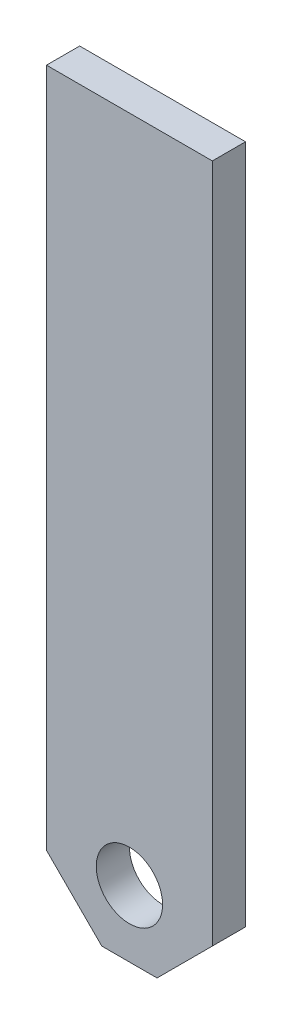
ISO-10303-21;
HEADER;
FILE_DESCRIPTION(('STEP AP214'),'2;1');
FILE_NAME('part.step','',(''),(''),'','','');
FILE_SCHEMA(('AUTOMOTIVE_DESIGN { 1 0 10303 214 1 1 1 1 }'));
ENDSEC;
DATA;
#1=APPLICATION_CONTEXT('core data for automotive mechanical design processes');
#2=APPLICATION_PROTOCOL_DEFINITION('international standard','automotive_design',2000,#1);
#3=PRODUCT_CONTEXT('',#1,'mechanical');
#4=PRODUCT('Part','Part','',(#3));
#5=PRODUCT_RELATED_PRODUCT_CATEGORY('part','',(#4));
#6=PRODUCT_DEFINITION_FORMATION('','',#4);
#7=PRODUCT_DEFINITION_CONTEXT('part definition',#1,'design');
#8=PRODUCT_DEFINITION('design','',#6,#7);
#9=PRODUCT_DEFINITION_SHAPE('','',#8);
#10=(LENGTH_UNIT() NAMED_UNIT(*) SI_UNIT(.MILLI.,.METRE.));
#11=(NAMED_UNIT(*) PLANE_ANGLE_UNIT() SI_UNIT($,.RADIAN.));
#12=(NAMED_UNIT(*) SI_UNIT($,.STERADIAN.) SOLID_ANGLE_UNIT());
#13=UNCERTAINTY_MEASURE_WITH_UNIT(LENGTH_MEASURE(1.E-05),#10,'distance_accuracy_value','');
#14=(GEOMETRIC_REPRESENTATION_CONTEXT(3) GLOBAL_UNCERTAINTY_ASSIGNED_CONTEXT((#13)) GLOBAL_UNIT_ASSIGNED_CONTEXT((#10,
#11,#12)) REPRESENTATION_CONTEXT('',''));
#15=CARTESIAN_POINT('',(0.,0.,0.));
#16=DIRECTION('',(0.,0.,1.));
#17=DIRECTION('',(1.,0.,0.));
#18=AXIS2_PLACEMENT_3D('',#15,#16,#17);
#19=CARTESIAN_POINT('',(-15.,0.,-6.00000000000001));
#20=DIRECTION('',(-1.,0.,0.));
#21=DIRECTION('',(0.,-1.,0.));
#22=AXIS2_PLACEMENT_3D('',#19,#20,#21);
#23=PLANE('',#22);
#24=DIRECTION('',(0.,-1.,0.));
#25=VECTOR('',#24,1.);
#26=CARTESIAN_POINT('',(-15.,0.,-6.00000000000001));
#27=LINE('',#26,#25);
#28=CARTESIAN_POINT('',(-15.,0.,-6.00000000000001));
#29=VERTEX_POINT('',#28);
#30=CARTESIAN_POINT('',(-15.,-123.,-6.00000000000001));
#31=VERTEX_POINT('',#30);
#32=EDGE_CURVE('E94',#29,#31,#27,.T.);
#33=ORIENTED_EDGE('',*,*,#32,.T.);
#34=DIRECTION('',(0.,0.,1.));
#35=VECTOR('',#34,1.);
#36=CARTESIAN_POINT('',(-15.,-123.,-6.00000000000001));
#37=LINE('',#36,#35);
#38=CARTESIAN_POINT('',(-15.,-123.,0.));
#39=VERTEX_POINT('',#38);
#40=EDGE_CURVE('E121',#31,#39,#37,.T.);
#41=ORIENTED_EDGE('',*,*,#40,.T.);
#42=DIRECTION('',(0.,-1.,0.));
#43=VECTOR('',#42,1.);
#44=CARTESIAN_POINT('',(-15.,0.,0.));
#45=LINE('',#44,#43);
#46=CARTESIAN_POINT('',(-15.,0.,0.));
#47=VERTEX_POINT('',#46);
#48=EDGE_CURVE('E111',#47,#39,#45,.T.);
#49=ORIENTED_EDGE('',*,*,#48,.F.);
#50=DIRECTION('',(0.,0.,1.));
#51=VECTOR('',#50,1.);
#52=CARTESIAN_POINT('',(-15.,0.,-6.00000000000001));
#53=LINE('',#52,#51);
#54=EDGE_CURVE('E103',#29,#47,#53,.T.);
#55=ORIENTED_EDGE('',*,*,#54,.F.);
#56=EDGE_LOOP('',(#33,#41,#49,#55));
#57=FACE_BOUND('',#56,.T.);
#58=ADVANCED_FACE('F36',(#57),#23,.T.);
#59=CARTESIAN_POINT('',(-15.,0.,-6.00000000000001));
#60=DIRECTION('',(0.,-1.,0.));
#61=DIRECTION('',(0.,0.,-1.));
#62=AXIS2_PLACEMENT_3D('',#59,#60,#61);
#63=PLANE('',#62);
#64=DIRECTION('',(1.,0.,0.));
#65=VECTOR('',#64,1.);
#66=CARTESIAN_POINT('',(-15.,0.,0.));
#67=LINE('',#66,#65);
#68=CARTESIAN_POINT('',(15.,0.,0.));
#69=VERTEX_POINT('',#68);
#70=EDGE_CURVE('E101',#47,#69,#67,.T.);
#71=ORIENTED_EDGE('',*,*,#70,.T.);
#72=DIRECTION('',(0.,0.,1.));
#73=VECTOR('',#72,1.);
#74=CARTESIAN_POINT('',(15.,0.,-6.00000000000001));
#75=LINE('',#74,#73);
#76=CARTESIAN_POINT('',(15.,0.,-6.00000000000001));
#77=VERTEX_POINT('',#76);
#78=EDGE_CURVE('E96',#77,#69,#75,.T.);
#79=ORIENTED_EDGE('',*,*,#78,.F.);
#80=DIRECTION('',(1.,0.,0.));
#81=VECTOR('',#80,1.);
#82=CARTESIAN_POINT('',(-15.,0.,-6.00000000000001));
#83=LINE('',#82,#81);
#84=EDGE_CURVE('E89',#29,#77,#83,.T.);
#85=ORIENTED_EDGE('',*,*,#84,.F.);
#86=ORIENTED_EDGE('',*,*,#54,.T.);
#87=EDGE_LOOP('',(#71,#79,#85,#86));
#88=FACE_BOUND('',#87,.T.);
#89=ADVANCED_FACE('F99',(#88),#63,.F.);
#90=CARTESIAN_POINT('',(15.,0.,-6.00000000000001));
#91=DIRECTION('',(-1.,0.,0.));
#92=DIRECTION('',(0.,-1.,0.));
#93=AXIS2_PLACEMENT_3D('',#90,#91,#92);
#94=PLANE('',#93);
#95=DIRECTION('',(0.,-1.,0.));
#96=VECTOR('',#95,1.);
#97=CARTESIAN_POINT('',(15.,0.,0.));
#98=LINE('',#97,#96);
#99=CARTESIAN_POINT('',(15.,-123.,0.));
#100=VERTEX_POINT('',#99);
#101=EDGE_CURVE('E118',#69,#100,#98,.T.);
#102=ORIENTED_EDGE('',*,*,#101,.T.);
#103=DIRECTION('',(0.,0.,-1.));
#104=VECTOR('',#103,1.);
#105=CARTESIAN_POINT('',(15.,-123.,-6.00000000000001));
#106=LINE('',#105,#104);
#107=CARTESIAN_POINT('',(15.,-123.,-6.00000000000001));
#108=VERTEX_POINT('',#107);
#109=EDGE_CURVE('E11',#100,#108,#106,.T.);
#110=ORIENTED_EDGE('',*,*,#109,.T.);
#111=DIRECTION('',(0.,-1.,0.));
#112=VECTOR('',#111,1.);
#113=CARTESIAN_POINT('',(15.,0.,-6.00000000000001));
#114=LINE('',#113,#112);
#115=EDGE_CURVE('E92',#77,#108,#114,.T.);
#116=ORIENTED_EDGE('',*,*,#115,.F.);
#117=ORIENTED_EDGE('',*,*,#78,.T.);
#118=EDGE_LOOP('',(#102,#110,#116,#117));
#119=FACE_BOUND('',#118,.T.);
#120=ADVANCED_FACE('F105',(#119),#94,.F.);
#121=CARTESIAN_POINT('',(-15.,-133.,-6.00000000000001));
#122=DIRECTION('',(0.,-1.,0.));
#123=DIRECTION('',(0.,0.,-1.));
#124=AXIS2_PLACEMENT_3D('',#121,#122,#123);
#125=PLANE('',#124);
#126=DIRECTION('',(1.,0.,0.));
#127=VECTOR('',#126,1.);
#128=CARTESIAN_POINT('',(-15.,-133.,0.));
#129=LINE('',#128,#127);
#130=CARTESIAN_POINT('',(-5.,-133.,0.));
#131=VERTEX_POINT('',#130);
#132=CARTESIAN_POINT('',(5.,-133.,0.));
#133=VERTEX_POINT('',#132);
#134=EDGE_CURVE('E114',#131,#133,#129,.T.);
#135=ORIENTED_EDGE('',*,*,#134,.F.);
#136=DIRECTION('',(0.,0.,-1.));
#137=VECTOR('',#136,1.);
#138=CARTESIAN_POINT('',(-5.,-133.,-6.00000000000001));
#139=LINE('',#138,#137);
#140=CARTESIAN_POINT('',(-5.,-133.,-6.00000000000001));
#141=VERTEX_POINT('',#140);
#142=EDGE_CURVE('E132',#131,#141,#139,.T.);
#143=ORIENTED_EDGE('',*,*,#142,.T.);
#144=DIRECTION('',(1.,0.,0.));
#145=VECTOR('',#144,1.);
#146=CARTESIAN_POINT('',(-15.,-133.,-6.00000000000001));
#147=LINE('',#146,#145);
#148=CARTESIAN_POINT('',(5.,-133.,-6.00000000000001));
#149=VERTEX_POINT('',#148);
#150=EDGE_CURVE('E106',#141,#149,#147,.T.);
#151=ORIENTED_EDGE('',*,*,#150,.T.);
#152=DIRECTION('',(0.,0.,1.));
#153=VECTOR('',#152,1.);
#154=CARTESIAN_POINT('',(5.,-133.,0.));
#155=LINE('',#154,#153);
#156=EDGE_CURVE('E129',#149,#133,#155,.T.);
#157=ORIENTED_EDGE('',*,*,#156,.T.);
#158=EDGE_LOOP('',(#135,#143,#151,#157));
#159=FACE_BOUND('',#158,.T.);
#160=ADVANCED_FACE('F145',(#159),#125,.T.);
#161=CARTESIAN_POINT('',(-15.,-133.,-6.00000000000001));
#162=DIRECTION('',(0.,0.,1.));
#163=DIRECTION('',(1.,0.,0.));
#164=AXIS2_PLACEMENT_3D('',#161,#162,#163);
#165=PLANE('',#164);
#166=CARTESIAN_POINT('',(0.,-121.,-6.00000000000001));
#167=DIRECTION('',(0.,0.,1.));
#168=DIRECTION('',(1.,0.,0.));
#169=AXIS2_PLACEMENT_3D('',#166,#167,#168);
#170=CIRCLE('',#169,6.);
#171=CARTESIAN_POINT('',(6.,-121.,-6.00000000000001));
#172=VERTEX_POINT('',#171);
#173=EDGE_CURVE('E115',#172,#172,#170,.T.);
#174=ORIENTED_EDGE('',*,*,#173,.T.);
#175=EDGE_LOOP('',(#174));
#176=FACE_BOUND('',#175,.T.);
#177=ORIENTED_EDGE('',*,*,#150,.F.);
#178=DIRECTION('',(0.707106781186549,-0.707106781186546,0.));
#179=VECTOR('',#178,1.);
#180=CARTESIAN_POINT('',(-15.,-123.,-6.00000000000001));
#181=LINE('',#180,#179);
#182=EDGE_CURVE('E44',#141,#31,#181,.F.);
#183=ORIENTED_EDGE('',*,*,#182,.T.);
#184=ORIENTED_EDGE('',*,*,#32,.F.);
#185=ORIENTED_EDGE('',*,*,#84,.T.);
#186=ORIENTED_EDGE('',*,*,#115,.T.);
#187=DIRECTION('',(-0.707106781186547,-0.707106781186548,0.));
#188=VECTOR('',#187,1.);
#189=CARTESIAN_POINT('',(5.,-133.,-6.00000000000001));
#190=LINE('',#189,#188);
#191=EDGE_CURVE('E56',#108,#149,#190,.T.);
#192=ORIENTED_EDGE('',*,*,#191,.T.);
#193=EDGE_LOOP('',(#177,#183,#184,#185,#186,#192));
#194=FACE_BOUND('',#193,.T.);
#195=ADVANCED_FACE('F91',(#176,#194),#165,.F.);
#196=CARTESIAN_POINT('',(-15.,-133.,0.));
#197=DIRECTION('',(0.,0.,1.));
#198=DIRECTION('',(1.,0.,0.));
#199=AXIS2_PLACEMENT_3D('',#196,#197,#198);
#200=PLANE('',#199);
#201=CARTESIAN_POINT('',(0.,-121.,0.));
#202=DIRECTION('',(0.,0.,1.));
#203=DIRECTION('',(1.,0.,0.));
#204=AXIS2_PLACEMENT_3D('',#201,#202,#203);
#205=CIRCLE('',#204,6.);
#206=CARTESIAN_POINT('',(6.,-121.,0.));
#207=VERTEX_POINT('',#206);
#208=EDGE_CURVE('E176',#207,#207,#205,.T.);
#209=ORIENTED_EDGE('',*,*,#208,.F.);
#210=EDGE_LOOP('',(#209));
#211=FACE_BOUND('',#210,.T.);
#212=ORIENTED_EDGE('',*,*,#48,.T.);
#213=DIRECTION('',(-0.707106781186549,0.707106781186546,0.));
#214=VECTOR('',#213,1.);
#215=CARTESIAN_POINT('',(-10.,-128.,0.));
#216=LINE('',#215,#214);
#217=EDGE_CURVE('E127',#39,#131,#216,.F.);
#218=ORIENTED_EDGE('',*,*,#217,.T.);
#219=ORIENTED_EDGE('',*,*,#134,.T.);
#220=DIRECTION('',(0.707106781186547,0.707106781186548,0.));
#221=VECTOR('',#220,1.);
#222=CARTESIAN_POINT('',(-5.,-143.,0.));
#223=LINE('',#222,#221);
#224=EDGE_CURVE('E125',#133,#100,#223,.T.);
#225=ORIENTED_EDGE('',*,*,#224,.T.);
#226=ORIENTED_EDGE('',*,*,#101,.F.);
#227=ORIENTED_EDGE('',*,*,#70,.F.);
#228=EDGE_LOOP('',(#212,#218,#219,#225,#226,#227));
#229=FACE_BOUND('',#228,.T.);
#230=ADVANCED_FACE('F143',(#211,#229),#200,.T.);
#231=CARTESIAN_POINT('',(-15.,-123.,-6.00000000000001));
#232=DIRECTION('',(0.707106781186546,0.707106781186549,0.));
#233=DIRECTION('',(-0.707106781186549,0.707106781186546,0.));
#234=AXIS2_PLACEMENT_3D('',#231,#232,#233);
#235=PLANE('',#234);
#236=ORIENTED_EDGE('',*,*,#182,.F.);
#237=ORIENTED_EDGE('',*,*,#142,.F.);
#238=ORIENTED_EDGE('',*,*,#217,.F.);
#239=ORIENTED_EDGE('',*,*,#40,.F.);
#240=EDGE_LOOP('',(#236,#237,#238,#239));
#241=FACE_BOUND('',#240,.T.);
#242=ADVANCED_FACE('F140',(#241),#235,.F.);
#243=CARTESIAN_POINT('',(5.,-133.,-6.00000000000001));
#244=DIRECTION('',(0.707106781186548,-0.707106781186547,0.));
#245=DIRECTION('',(0.707106781186547,0.707106781186548,0.));
#246=AXIS2_PLACEMENT_3D('',#243,#244,#245);
#247=PLANE('',#246);
#248=ORIENTED_EDGE('',*,*,#191,.F.);
#249=ORIENTED_EDGE('',*,*,#109,.F.);
#250=ORIENTED_EDGE('',*,*,#224,.F.);
#251=ORIENTED_EDGE('',*,*,#156,.F.);
#252=EDGE_LOOP('',(#248,#249,#250,#251));
#253=FACE_BOUND('',#252,.T.);
#254=ADVANCED_FACE('F38',(#253),#247,.T.);
#255=CARTESIAN_POINT('',(0.,-121.,-6.00000000000001));
#256=DIRECTION('',(0.,0.,1.));
#257=DIRECTION('',(1.,0.,0.));
#258=AXIS2_PLACEMENT_3D('',#255,#256,#257);
#259=CYLINDRICAL_SURFACE('',#258,6.);
#260=ORIENTED_EDGE('',*,*,#173,.F.);
#261=EDGE_LOOP('',(#260));
#262=FACE_BOUND('',#261,.T.);
#263=ORIENTED_EDGE('',*,*,#208,.T.);
#264=EDGE_LOOP('',(#263));
#265=FACE_BOUND('',#264,.T.);
#266=ADVANCED_FACE('F149',(#262,#265),#259,.F.);
#267=CLOSED_SHELL('',(#58,#89,#120,#160,#195,#230,#242,#254,#266));
#268=MANIFOLD_SOLID_BREP('B2',#267);
#269=ADVANCED_BREP_SHAPE_REPRESENTATION('',(#18,#268),#14);
#270=SHAPE_DEFINITION_REPRESENTATION(#9,#269);
ENDSEC;
END-ISO-10303-21;
